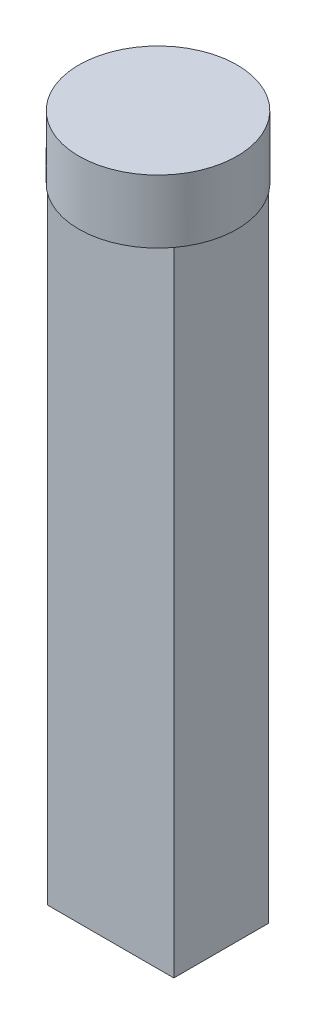
ISO-10303-21;
HEADER;
FILE_DESCRIPTION(('STEP AP214'),'2;1');
FILE_NAME('part.step','',(''),(''),'','','');
FILE_SCHEMA(('AUTOMOTIVE_DESIGN { 1 0 10303 214 1 1 1 1 }'));
ENDSEC;
DATA;
#1=APPLICATION_CONTEXT('core data for automotive mechanical design processes');
#2=APPLICATION_PROTOCOL_DEFINITION('international standard','automotive_design',2000,#1);
#3=PRODUCT_CONTEXT('',#1,'mechanical');
#4=PRODUCT('Part','Part','',(#3));
#5=PRODUCT_RELATED_PRODUCT_CATEGORY('part','',(#4));
#6=PRODUCT_DEFINITION_FORMATION('','',#4);
#7=PRODUCT_DEFINITION_CONTEXT('part definition',#1,'design');
#8=PRODUCT_DEFINITION('design','',#6,#7);
#9=PRODUCT_DEFINITION_SHAPE('','',#8);
#10=(LENGTH_UNIT() NAMED_UNIT(*) SI_UNIT(.MILLI.,.METRE.));
#11=(NAMED_UNIT(*) PLANE_ANGLE_UNIT() SI_UNIT($,.RADIAN.));
#12=(NAMED_UNIT(*) SI_UNIT($,.STERADIAN.) SOLID_ANGLE_UNIT());
#13=UNCERTAINTY_MEASURE_WITH_UNIT(LENGTH_MEASURE(1.E-05),#10,'distance_accuracy_value','');
#14=(GEOMETRIC_REPRESENTATION_CONTEXT(3) GLOBAL_UNCERTAINTY_ASSIGNED_CONTEXT((#13)) GLOBAL_UNIT_ASSIGNED_CONTEXT((#10,
#11,#12)) REPRESENTATION_CONTEXT('',''));
#15=CARTESIAN_POINT('',(0.,0.,0.));
#16=DIRECTION('',(0.,0.,1.));
#17=DIRECTION('',(1.,0.,0.));
#18=AXIS2_PLACEMENT_3D('',#15,#16,#17);
#19=CARTESIAN_POINT('',(-10.,100.,7.5));
#20=DIRECTION('',(1.,0.,0.));
#21=DIRECTION('',(0.,0.,-1.));
#22=AXIS2_PLACEMENT_3D('',#19,#20,#21);
#23=PLANE('',#22);
#24=DIRECTION('',(0.,0.,1.));
#25=VECTOR('',#24,1.);
#26=CARTESIAN_POINT('',(-10.,0.,7.5));
#27=LINE('',#26,#25);
#28=CARTESIAN_POINT('',(-10.,0.,-7.5));
#29=VERTEX_POINT('',#28);
#30=CARTESIAN_POINT('',(-10.,0.,7.5));
#31=VERTEX_POINT('',#30);
#32=EDGE_CURVE('E117',#29,#31,#27,.T.);
#33=ORIENTED_EDGE('',*,*,#32,.T.);
#34=DIRECTION('',(0.,-1.,0.));
#35=VECTOR('',#34,1.);
#36=CARTESIAN_POINT('',(-10.,100.,7.5));
#37=LINE('',#36,#35);
#38=CARTESIAN_POINT('',(-10.,100.,7.5));
#39=VERTEX_POINT('',#38);
#40=EDGE_CURVE('E11',#39,#31,#37,.T.);
#41=ORIENTED_EDGE('',*,*,#40,.F.);
#42=DIRECTION('',(0.,0.,1.));
#43=VECTOR('',#42,1.);
#44=CARTESIAN_POINT('',(-10.,100.,7.5));
#45=LINE('',#44,#43);
#46=CARTESIAN_POINT('',(-10.,100.,-7.5));
#47=VERTEX_POINT('',#46);
#48=EDGE_CURVE('E81',#47,#39,#45,.T.);
#49=ORIENTED_EDGE('',*,*,#48,.F.);
#50=DIRECTION('',(0.,-1.,0.));
#51=VECTOR('',#50,1.);
#52=CARTESIAN_POINT('',(-10.,100.,-7.5));
#53=LINE('',#52,#51);
#54=EDGE_CURVE('E83',#47,#29,#53,.T.);
#55=ORIENTED_EDGE('',*,*,#54,.T.);
#56=EDGE_LOOP('',(#33,#41,#49,#55));
#57=FACE_BOUND('',#56,.T.);
#58=ADVANCED_FACE('F33',(#57),#23,.F.);
#59=CARTESIAN_POINT('',(10.,100.,7.5));
#60=DIRECTION('',(0.,0.,-1.));
#61=DIRECTION('',(-1.,0.,0.));
#62=AXIS2_PLACEMENT_3D('',#59,#60,#61);
#63=PLANE('',#62);
#64=DIRECTION('',(1.,0.,0.));
#65=VECTOR('',#64,1.);
#66=CARTESIAN_POINT('',(10.,0.,7.5));
#67=LINE('',#66,#65);
#68=CARTESIAN_POINT('',(10.,0.,7.5));
#69=VERTEX_POINT('',#68);
#70=EDGE_CURVE('E119',#31,#69,#67,.T.);
#71=ORIENTED_EDGE('',*,*,#70,.T.);
#72=DIRECTION('',(0.,-1.,0.));
#73=VECTOR('',#72,1.);
#74=CARTESIAN_POINT('',(10.,100.,7.5));
#75=LINE('',#74,#73);
#76=CARTESIAN_POINT('',(10.,100.,7.5));
#77=VERTEX_POINT('',#76);
#78=EDGE_CURVE('E41',#77,#69,#75,.T.);
#79=ORIENTED_EDGE('',*,*,#78,.F.);
#80=DIRECTION('',(1.,0.,0.));
#81=VECTOR('',#80,1.);
#82=CARTESIAN_POINT('',(10.,100.,7.5));
#83=LINE('',#82,#81);
#84=EDGE_CURVE('E75',#39,#77,#83,.T.);
#85=ORIENTED_EDGE('',*,*,#84,.F.);
#86=ORIENTED_EDGE('',*,*,#40,.T.);
#87=EDGE_LOOP('',(#71,#79,#85,#86));
#88=FACE_BOUND('',#87,.T.);
#89=ADVANCED_FACE('F126',(#88),#63,.F.);
#90=CARTESIAN_POINT('',(10.,100.,7.5));
#91=DIRECTION('',(-1.,0.,0.));
#92=DIRECTION('',(0.,0.,1.));
#93=AXIS2_PLACEMENT_3D('',#90,#91,#92);
#94=PLANE('',#93);
#95=DIRECTION('',(0.,0.,-1.));
#96=VECTOR('',#95,1.);
#97=CARTESIAN_POINT('',(10.,0.,7.5));
#98=LINE('',#97,#96);
#99=CARTESIAN_POINT('',(10.,0.,-7.5));
#100=VERTEX_POINT('',#99);
#101=EDGE_CURVE('E65',#69,#100,#98,.T.);
#102=ORIENTED_EDGE('',*,*,#101,.T.);
#103=DIRECTION('',(0.,-1.,0.));
#104=VECTOR('',#103,1.);
#105=CARTESIAN_POINT('',(10.,100.,-7.5));
#106=LINE('',#105,#104);
#107=CARTESIAN_POINT('',(10.,100.,-7.5));
#108=VERTEX_POINT('',#107);
#109=EDGE_CURVE('E49',#108,#100,#106,.T.);
#110=ORIENTED_EDGE('',*,*,#109,.F.);
#111=DIRECTION('',(0.,0.,-1.));
#112=VECTOR('',#111,1.);
#113=CARTESIAN_POINT('',(10.,100.,7.5));
#114=LINE('',#113,#112);
#115=EDGE_CURVE('E100',#77,#108,#114,.T.);
#116=ORIENTED_EDGE('',*,*,#115,.F.);
#117=ORIENTED_EDGE('',*,*,#78,.T.);
#118=EDGE_LOOP('',(#102,#110,#116,#117));
#119=FACE_BOUND('',#118,.T.);
#120=ADVANCED_FACE('F123',(#119),#94,.F.);
#121=CARTESIAN_POINT('',(10.,100.,-7.5));
#122=DIRECTION('',(0.,0.,1.));
#123=DIRECTION('',(1.,0.,0.));
#124=AXIS2_PLACEMENT_3D('',#121,#122,#123);
#125=PLANE('',#124);
#126=DIRECTION('',(-1.,0.,0.));
#127=VECTOR('',#126,1.);
#128=CARTESIAN_POINT('',(10.,0.,-7.5));
#129=LINE('',#128,#127);
#130=EDGE_CURVE('E70',#100,#29,#129,.T.);
#131=ORIENTED_EDGE('',*,*,#130,.T.);
#132=ORIENTED_EDGE('',*,*,#54,.F.);
#133=DIRECTION('',(-1.,0.,0.));
#134=VECTOR('',#133,1.);
#135=CARTESIAN_POINT('',(10.,100.,-7.5));
#136=LINE('',#135,#134);
#137=EDGE_CURVE('E91',#108,#47,#136,.T.);
#138=ORIENTED_EDGE('',*,*,#137,.F.);
#139=ORIENTED_EDGE('',*,*,#109,.T.);
#140=EDGE_LOOP('',(#131,#132,#138,#139));
#141=FACE_BOUND('',#140,.T.);
#142=ADVANCED_FACE('F90',(#141),#125,.F.);
#143=CARTESIAN_POINT('',(0.,0.,0.));
#144=DIRECTION('',(0.,1.,0.));
#145=DIRECTION('',(0.,0.,1.));
#146=AXIS2_PLACEMENT_3D('',#143,#144,#145);
#147=PLANE('',#146);
#148=ORIENTED_EDGE('',*,*,#32,.F.);
#149=ORIENTED_EDGE('',*,*,#130,.F.);
#150=ORIENTED_EDGE('',*,*,#101,.F.);
#151=ORIENTED_EDGE('',*,*,#70,.F.);
#152=EDGE_LOOP('',(#148,#149,#150,#151));
#153=FACE_BOUND('',#152,.T.);
#154=ADVANCED_FACE('F125',(#153),#147,.F.);
#155=CARTESIAN_POINT('',(0.,100.,0.));
#156=DIRECTION('',(0.,1.,0.));
#157=DIRECTION('',(0.,0.,1.));
#158=AXIS2_PLACEMENT_3D('',#155,#156,#157);
#159=PLANE('',#158);
#160=CARTESIAN_POINT('',(0.,100.,0.));
#161=DIRECTION('',(0.,1.,0.));
#162=DIRECTION('',(0.,0.,1.));
#163=AXIS2_PLACEMENT_3D('',#160,#161,#162);
#164=CIRCLE('',#163,12.5);
#165=EDGE_CURVE('E103',#47,#39,#164,.T.);
#166=ORIENTED_EDGE('',*,*,#165,.F.);
#167=ORIENTED_EDGE('',*,*,#48,.T.);
#168=EDGE_LOOP('',(#166,#167));
#169=FACE_BOUND('',#168,.T.);
#170=ADVANCED_FACE('F104',(#169),#159,.F.);
#171=EDGE_CURVE('E107',#39,#77,#164,.T.);
#172=ORIENTED_EDGE('',*,*,#171,.F.);
#173=ORIENTED_EDGE('',*,*,#84,.T.);
#174=EDGE_LOOP('',(#172,#173));
#175=FACE_BOUND('',#174,.T.);
#176=ADVANCED_FACE('F173',(#175),#159,.F.);
#177=EDGE_CURVE('E111',#77,#108,#164,.T.);
#178=ORIENTED_EDGE('',*,*,#177,.F.);
#179=ORIENTED_EDGE('',*,*,#115,.T.);
#180=EDGE_LOOP('',(#178,#179));
#181=FACE_BOUND('',#180,.T.);
#182=ADVANCED_FACE('F141',(#181),#159,.F.);
#183=CARTESIAN_POINT('',(0.,110.,0.));
#184=DIRECTION('',(0.,-1.,0.));
#185=DIRECTION('',(0.,0.,-1.));
#186=AXIS2_PLACEMENT_3D('',#183,#184,#185);
#187=CYLINDRICAL_SURFACE('',#186,12.5);
#188=CARTESIAN_POINT('',(0.,110.,0.));
#189=DIRECTION('',(0.,1.,0.));
#190=DIRECTION('',(0.,0.,1.));
#191=AXIS2_PLACEMENT_3D('',#188,#189,#190);
#192=CIRCLE('',#191,12.5);
#193=CARTESIAN_POINT('',(0.,110.,12.5));
#194=VERTEX_POINT('',#193);
#195=EDGE_CURVE('E112',#194,#194,#192,.T.);
#196=ORIENTED_EDGE('',*,*,#195,.F.);
#197=EDGE_LOOP('',(#196));
#198=FACE_BOUND('',#197,.T.);
#199=ORIENTED_EDGE('',*,*,#177,.T.);
#200=EDGE_CURVE('E98',#108,#47,#164,.T.);
#201=ORIENTED_EDGE('',*,*,#200,.T.);
#202=ORIENTED_EDGE('',*,*,#165,.T.);
#203=ORIENTED_EDGE('',*,*,#171,.T.);
#204=EDGE_LOOP('',(#199,#201,#202,#203));
#205=FACE_BOUND('',#204,.T.);
#206=ADVANCED_FACE('F109',(#198,#205),#187,.T.);
#207=CARTESIAN_POINT('',(0.,110.,0.));
#208=DIRECTION('',(0.,1.,0.));
#209=DIRECTION('',(0.,0.,1.));
#210=AXIS2_PLACEMENT_3D('',#207,#208,#209);
#211=PLANE('',#210);
#212=ORIENTED_EDGE('',*,*,#195,.T.);
#213=EDGE_LOOP('',(#212));
#214=FACE_BOUND('',#213,.T.);
#215=ADVANCED_FACE('F140',(#214),#211,.T.);
#216=ORIENTED_EDGE('',*,*,#200,.F.);
#217=ORIENTED_EDGE('',*,*,#137,.T.);
#218=EDGE_LOOP('',(#216,#217));
#219=FACE_BOUND('',#218,.T.);
#220=ADVANCED_FACE('F96',(#219),#159,.F.);
#221=CLOSED_SHELL('',(#58,#89,#120,#142,#154,#170,#176,#182,#206,#215,#220));
#222=MANIFOLD_SOLID_BREP('B2',#221);
#223=ADVANCED_BREP_SHAPE_REPRESENTATION('',(#18,#222),#14);
#224=SHAPE_DEFINITION_REPRESENTATION(#9,#223);
ENDSEC;
END-ISO-10303-21;
